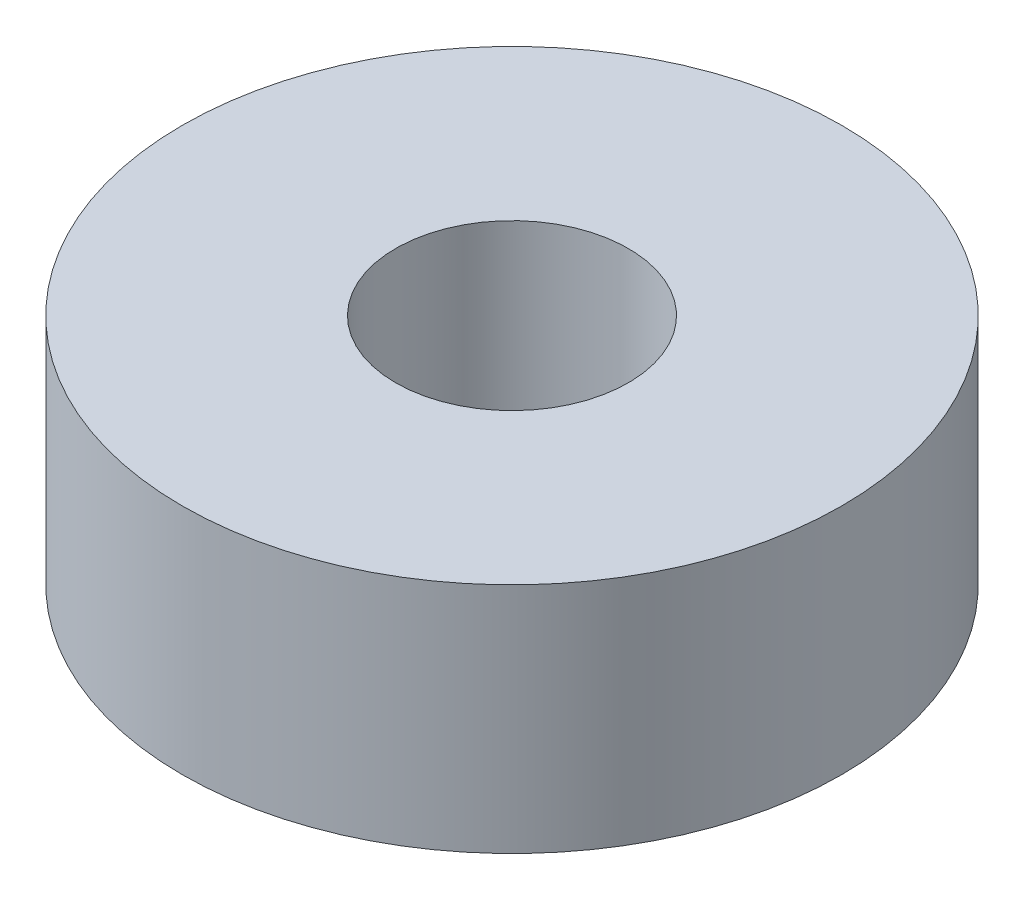
ISO-10303-21;
HEADER;
FILE_DESCRIPTION(('STEP AP214'),'2;1');
FILE_NAME('part.step','',(''),(''),'','','');
FILE_SCHEMA(('AUTOMOTIVE_DESIGN { 1 0 10303 214 1 1 1 1 }'));
ENDSEC;
DATA;
#1=APPLICATION_CONTEXT('core data for automotive mechanical design processes');
#2=APPLICATION_PROTOCOL_DEFINITION('international standard','automotive_design',2000,#1);
#3=PRODUCT_CONTEXT('',#1,'mechanical');
#4=PRODUCT('Part','Part','',(#3));
#5=PRODUCT_RELATED_PRODUCT_CATEGORY('part','',(#4));
#6=PRODUCT_DEFINITION_FORMATION('','',#4);
#7=PRODUCT_DEFINITION_CONTEXT('part definition',#1,'design');
#8=PRODUCT_DEFINITION('design','',#6,#7);
#9=PRODUCT_DEFINITION_SHAPE('','',#8);
#10=(LENGTH_UNIT() NAMED_UNIT(*) SI_UNIT(.MILLI.,.METRE.));
#11=(NAMED_UNIT(*) PLANE_ANGLE_UNIT() SI_UNIT($,.RADIAN.));
#12=(NAMED_UNIT(*) SI_UNIT($,.STERADIAN.) SOLID_ANGLE_UNIT());
#13=UNCERTAINTY_MEASURE_WITH_UNIT(LENGTH_MEASURE(1.E-05),#10,'distance_accuracy_value','');
#14=(GEOMETRIC_REPRESENTATION_CONTEXT(3) GLOBAL_UNCERTAINTY_ASSIGNED_CONTEXT((#13)) GLOBAL_UNIT_ASSIGNED_CONTEXT((#10,
#11,#12)) REPRESENTATION_CONTEXT('',''));
#15=CARTESIAN_POINT('',(0.,0.,0.));
#16=DIRECTION('',(0.,0.,1.));
#17=DIRECTION('',(1.,0.,0.));
#18=AXIS2_PLACEMENT_3D('',#15,#16,#17);
#19=CARTESIAN_POINT('',(0.,6.,0.));
#20=DIRECTION('',(0.,1.,0.));
#21=DIRECTION('',(0.,0.,1.));
#22=AXIS2_PLACEMENT_3D('',#19,#20,#21);
#23=PLANE('',#22);
#24=CARTESIAN_POINT('',(0.,6.,0.));
#25=DIRECTION('',(0.,1.,0.));
#26=DIRECTION('',(0.,0.,1.));
#27=AXIS2_PLACEMENT_3D('',#24,#25,#26);
#28=CIRCLE('',#27,8.5);
#29=CARTESIAN_POINT('',(0.,6.,8.5));
#30=VERTEX_POINT('',#29);
#31=EDGE_CURVE('E10',#30,#30,#28,.T.);
#32=ORIENTED_EDGE('',*,*,#31,.T.);
#33=EDGE_LOOP('',(#32));
#34=FACE_BOUND('',#33,.T.);
#35=CARTESIAN_POINT('',(0.,6.,0.));
#36=DIRECTION('',(0.,1.,0.));
#37=DIRECTION('',(0.,0.,1.));
#38=AXIS2_PLACEMENT_3D('',#35,#36,#37);
#39=CIRCLE('',#38,3.);
#40=CARTESIAN_POINT('',(0.,6.,3.));
#41=VERTEX_POINT('',#40);
#42=EDGE_CURVE('E41',#41,#41,#39,.T.);
#43=ORIENTED_EDGE('',*,*,#42,.F.);
#44=EDGE_LOOP('',(#43));
#45=FACE_BOUND('',#44,.T.);
#46=ADVANCED_FACE('F30',(#34,#45),#23,.T.);
#47=CARTESIAN_POINT('',(0.,0.,0.));
#48=DIRECTION('',(0.,1.,0.));
#49=DIRECTION('',(0.,0.,1.));
#50=AXIS2_PLACEMENT_3D('',#47,#48,#49);
#51=PLANE('',#50);
#52=CARTESIAN_POINT('',(0.,0.,0.));
#53=DIRECTION('',(0.,1.,0.));
#54=DIRECTION('',(0.,0.,1.));
#55=AXIS2_PLACEMENT_3D('',#52,#53,#54);
#56=CIRCLE('',#55,8.5);
#57=CARTESIAN_POINT('',(0.,0.,8.5));
#58=VERTEX_POINT('',#57);
#59=EDGE_CURVE('E34',#58,#58,#56,.T.);
#60=ORIENTED_EDGE('',*,*,#59,.F.);
#61=EDGE_LOOP('',(#60));
#62=FACE_BOUND('',#61,.T.);
#63=CARTESIAN_POINT('',(0.,0.,0.));
#64=DIRECTION('',(0.,1.,0.));
#65=DIRECTION('',(0.,0.,1.));
#66=AXIS2_PLACEMENT_3D('',#63,#64,#65);
#67=CIRCLE('',#66,3.);
#68=CARTESIAN_POINT('',(0.,0.,3.));
#69=VERTEX_POINT('',#68);
#70=EDGE_CURVE('E43',#69,#69,#67,.T.);
#71=ORIENTED_EDGE('',*,*,#70,.T.);
#72=EDGE_LOOP('',(#71));
#73=FACE_BOUND('',#72,.T.);
#74=ADVANCED_FACE('F53',(#62,#73),#51,.F.);
#75=CARTESIAN_POINT('',(0.,6.,0.));
#76=DIRECTION('',(0.,-1.,0.));
#77=DIRECTION('',(0.,0.,-1.));
#78=AXIS2_PLACEMENT_3D('',#75,#76,#77);
#79=CYLINDRICAL_SURFACE('',#78,8.5);
#80=ORIENTED_EDGE('',*,*,#31,.F.);
#81=EDGE_LOOP('',(#80));
#82=FACE_BOUND('',#81,.T.);
#83=ORIENTED_EDGE('',*,*,#59,.T.);
#84=EDGE_LOOP('',(#83));
#85=FACE_BOUND('',#84,.T.);
#86=ADVANCED_FACE('F32',(#82,#85),#79,.T.);
#87=CARTESIAN_POINT('',(0.,6.,0.));
#88=DIRECTION('',(0.,-1.,0.));
#89=DIRECTION('',(0.,0.,-1.));
#90=AXIS2_PLACEMENT_3D('',#87,#88,#89);
#91=CYLINDRICAL_SURFACE('',#90,3.);
#92=ORIENTED_EDGE('',*,*,#42,.T.);
#93=EDGE_LOOP('',(#92));
#94=FACE_BOUND('',#93,.T.);
#95=ORIENTED_EDGE('',*,*,#70,.F.);
#96=EDGE_LOOP('',(#95));
#97=FACE_BOUND('',#96,.T.);
#98=ADVANCED_FACE('F49',(#94,#97),#91,.F.);
#99=CLOSED_SHELL('',(#46,#74,#86,#98));
#100=MANIFOLD_SOLID_BREP('B2',#99);
#101=ADVANCED_BREP_SHAPE_REPRESENTATION('',(#18,#100),#14);
#102=SHAPE_DEFINITION_REPRESENTATION(#9,#101);
ENDSEC;
END-ISO-10303-21;
